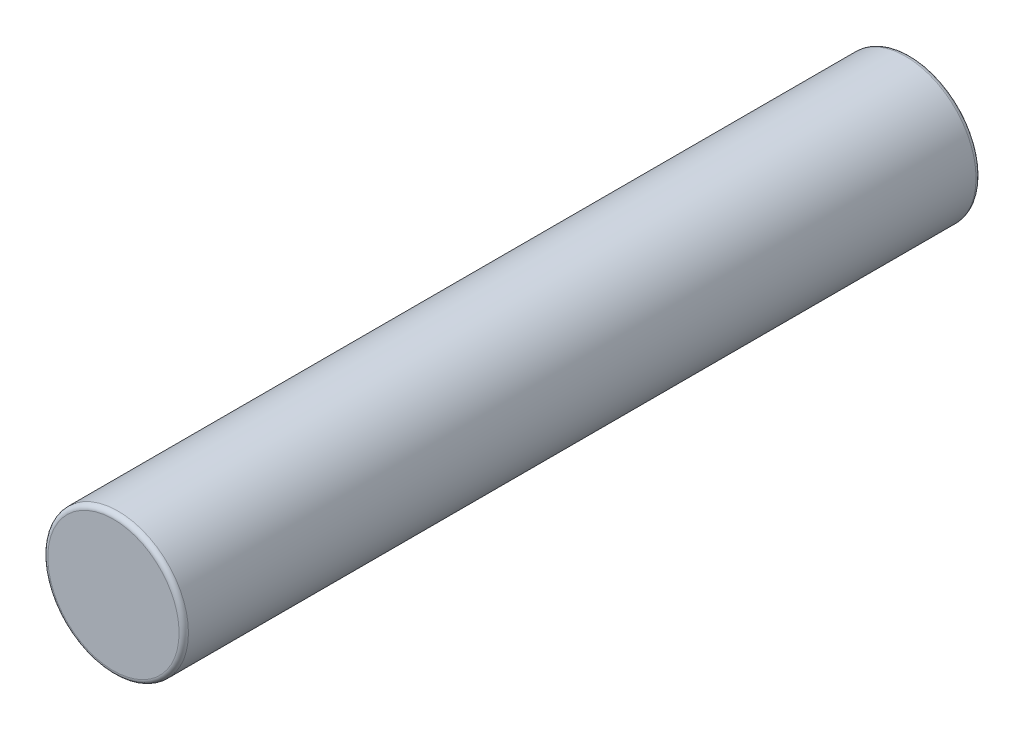
ISO-10303-21;
HEADER;
FILE_DESCRIPTION(('STEP AP214'),'2;1');
FILE_NAME('part.step','',(''),(''),'','','');
FILE_SCHEMA(('AUTOMOTIVE_DESIGN { 1 0 10303 214 1 1 1 1 }'));
ENDSEC;
DATA;
#1=APPLICATION_CONTEXT('core data for automotive mechanical design processes');
#2=APPLICATION_PROTOCOL_DEFINITION('international standard','automotive_design',2000,#1);
#3=PRODUCT_CONTEXT('',#1,'mechanical');
#4=PRODUCT('Part','Part','',(#3));
#5=PRODUCT_RELATED_PRODUCT_CATEGORY('part','',(#4));
#6=PRODUCT_DEFINITION_FORMATION('','',#4);
#7=PRODUCT_DEFINITION_CONTEXT('part definition',#1,'design');
#8=PRODUCT_DEFINITION('design','',#6,#7);
#9=PRODUCT_DEFINITION_SHAPE('','',#8);
#10=(LENGTH_UNIT() NAMED_UNIT(*) SI_UNIT(.MILLI.,.METRE.));
#11=(NAMED_UNIT(*) PLANE_ANGLE_UNIT() SI_UNIT($,.RADIAN.));
#12=(NAMED_UNIT(*) SI_UNIT($,.STERADIAN.) SOLID_ANGLE_UNIT());
#13=UNCERTAINTY_MEASURE_WITH_UNIT(LENGTH_MEASURE(1.E-05),#10,'distance_accuracy_value','');
#14=(GEOMETRIC_REPRESENTATION_CONTEXT(3) GLOBAL_UNCERTAINTY_ASSIGNED_CONTEXT((#13)) GLOBAL_UNIT_ASSIGNED_CONTEXT((#10,
#11,#12)) REPRESENTATION_CONTEXT('',''));
#15=CARTESIAN_POINT('',(0.,0.,0.));
#16=DIRECTION('',(0.,0.,1.));
#17=DIRECTION('',(1.,0.,0.));
#18=AXIS2_PLACEMENT_3D('',#15,#16,#17);
#19=CARTESIAN_POINT('',(0.,0.,34.));
#20=DIRECTION('',(0.,0.,-1.));
#21=DIRECTION('',(-1.,0.,0.));
#22=AXIS2_PLACEMENT_3D('',#19,#20,#21);
#23=CYLINDRICAL_SURFACE('',#22,3.);
#24=CARTESIAN_POINT('',(0.,0.,0.199999999999999));
#25=DIRECTION('',(0.,0.,1.));
#26=DIRECTION('',(1.,0.,0.));
#27=AXIS2_PLACEMENT_3D('',#24,#25,#26);
#28=CIRCLE('',#27,3.);
#29=CARTESIAN_POINT('',(3.,0.,0.199999999999999));
#30=VERTEX_POINT('',#29);
#31=EDGE_CURVE('E42',#30,#30,#28,.T.);
#32=ORIENTED_EDGE('',*,*,#31,.T.);
#33=EDGE_LOOP('',(#32));
#34=FACE_BOUND('',#33,.T.);
#35=CARTESIAN_POINT('',(0.,0.,33.8));
#36=DIRECTION('',(0.,0.,1.));
#37=DIRECTION('',(1.,0.,0.));
#38=AXIS2_PLACEMENT_3D('',#35,#36,#37);
#39=CIRCLE('',#38,3.);
#40=CARTESIAN_POINT('',(3.,0.,33.8));
#41=VERTEX_POINT('',#40);
#42=EDGE_CURVE('E46',#41,#41,#39,.F.);
#43=ORIENTED_EDGE('',*,*,#42,.T.);
#44=EDGE_LOOP('',(#43));
#45=FACE_BOUND('',#44,.T.);
#46=ADVANCED_FACE('F31',(#34,#45),#23,.T.);
#47=CARTESIAN_POINT('',(0.,0.,34.));
#48=DIRECTION('',(0.,0.,1.));
#49=DIRECTION('',(1.,0.,0.));
#50=AXIS2_PLACEMENT_3D('',#47,#48,#49);
#51=PLANE('',#50);
#52=CARTESIAN_POINT('',(0.,0.,34.));
#53=DIRECTION('',(0.,0.,1.));
#54=DIRECTION('',(1.,0.,0.));
#55=AXIS2_PLACEMENT_3D('',#52,#53,#54);
#56=CIRCLE('',#55,2.8);
#57=CARTESIAN_POINT('',(2.8,0.,34.));
#58=VERTEX_POINT('',#57);
#59=EDGE_CURVE('E10',#58,#58,#56,.T.);
#60=ORIENTED_EDGE('',*,*,#59,.T.);
#61=EDGE_LOOP('',(#60));
#62=FACE_BOUND('',#61,.T.);
#63=ADVANCED_FACE('F62',(#62),#51,.T.);
#64=CARTESIAN_POINT('',(0.,0.,0.));
#65=DIRECTION('',(0.,0.,1.));
#66=DIRECTION('',(1.,0.,0.));
#67=AXIS2_PLACEMENT_3D('',#64,#65,#66);
#68=PLANE('',#67);
#69=CARTESIAN_POINT('',(0.,0.,0.));
#70=DIRECTION('',(0.,0.,1.));
#71=DIRECTION('',(1.,0.,0.));
#72=AXIS2_PLACEMENT_3D('',#69,#70,#71);
#73=CIRCLE('',#72,2.8);
#74=CARTESIAN_POINT('',(2.8,0.,0.));
#75=VERTEX_POINT('',#74);
#76=EDGE_CURVE('E38',#75,#75,#73,.F.);
#77=ORIENTED_EDGE('',*,*,#76,.T.);
#78=EDGE_LOOP('',(#77));
#79=FACE_BOUND('',#78,.T.);
#80=ADVANCED_FACE('F59',(#79),#68,.F.);
#81=CARTESIAN_POINT('',(0.,0.,0.199999999999999));
#82=DIRECTION('',(0.,0.,1.));
#83=DIRECTION('',(1.,0.,0.));
#84=AXIS2_PLACEMENT_3D('',#81,#82,#83);
#85=TOROIDAL_SURFACE('',#84,2.8,0.2);
#86=ORIENTED_EDGE('',*,*,#76,.F.);
#87=EDGE_LOOP('',(#86));
#88=FACE_BOUND('',#87,.T.);
#89=ORIENTED_EDGE('',*,*,#31,.F.);
#90=EDGE_LOOP('',(#89));
#91=FACE_BOUND('',#90,.T.);
#92=ADVANCED_FACE('F55',(#88,#91),#85,.T.);
#93=CARTESIAN_POINT('',(0.,0.,33.8));
#94=DIRECTION('',(0.,0.,1.));
#95=DIRECTION('',(1.,0.,0.));
#96=AXIS2_PLACEMENT_3D('',#93,#94,#95);
#97=TOROIDAL_SURFACE('',#96,2.8,0.2);
#98=ORIENTED_EDGE('',*,*,#42,.F.);
#99=EDGE_LOOP('',(#98));
#100=FACE_BOUND('',#99,.T.);
#101=ORIENTED_EDGE('',*,*,#59,.F.);
#102=EDGE_LOOP('',(#101));
#103=FACE_BOUND('',#102,.T.);
#104=ADVANCED_FACE('F33',(#100,#103),#97,.T.);
#105=CLOSED_SHELL('',(#46,#63,#80,#92,#104));
#106=MANIFOLD_SOLID_BREP('B2',#105);
#107=ADVANCED_BREP_SHAPE_REPRESENTATION('',(#18,#106),#14);
#108=SHAPE_DEFINITION_REPRESENTATION(#9,#107);
ENDSEC;
END-ISO-10303-21;
